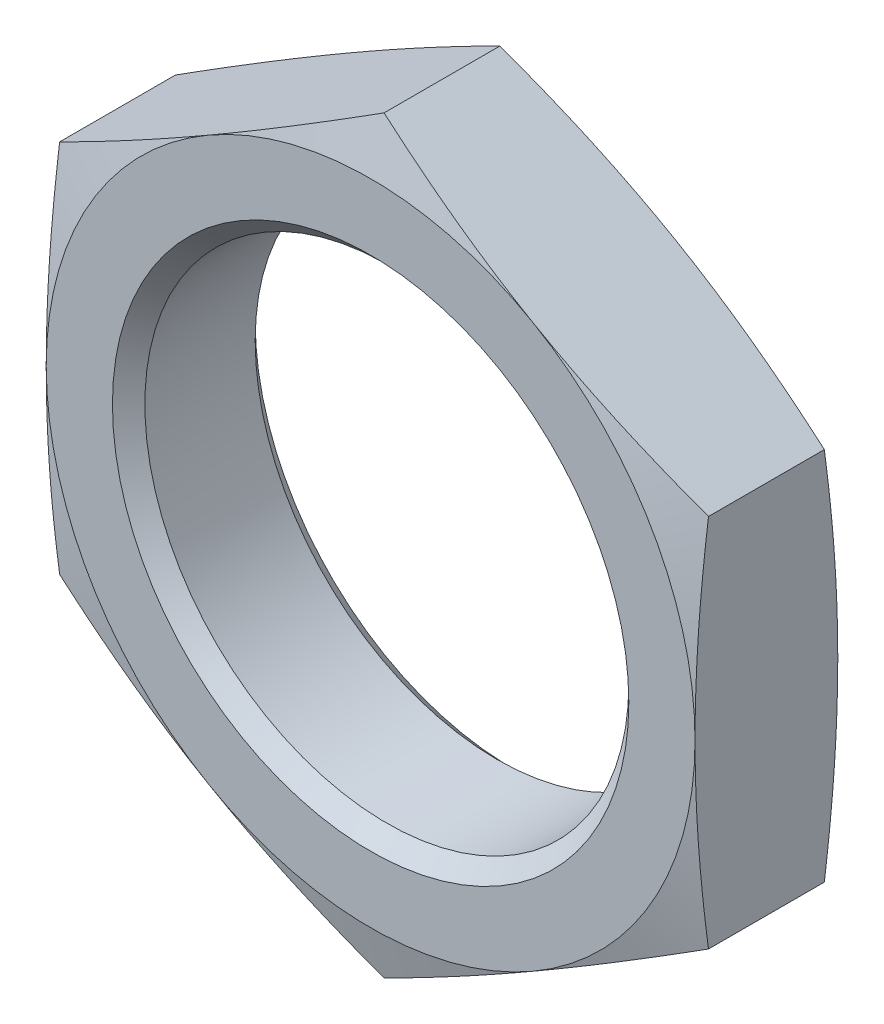
ISO-10303-21;
HEADER;
FILE_DESCRIPTION(('STEP AP214'),'2;1');
FILE_NAME('part.step','',(''),(''),'','','');
FILE_SCHEMA(('AUTOMOTIVE_DESIGN { 1 0 10303 214 1 1 1 1 }'));
ENDSEC;
DATA;
#1=APPLICATION_CONTEXT('core data for automotive mechanical design processes');
#2=APPLICATION_PROTOCOL_DEFINITION('international standard','automotive_design',2000,#1);
#3=PRODUCT_CONTEXT('',#1,'mechanical');
#4=PRODUCT('Part','Part','',(#3));
#5=PRODUCT_RELATED_PRODUCT_CATEGORY('part','',(#4));
#6=PRODUCT_DEFINITION_FORMATION('','',#4);
#7=PRODUCT_DEFINITION_CONTEXT('part definition',#1,'design');
#8=PRODUCT_DEFINITION('design','',#6,#7);
#9=PRODUCT_DEFINITION_SHAPE('','',#8);
#10=(LENGTH_UNIT() NAMED_UNIT(*) SI_UNIT(.MILLI.,.METRE.));
#11=(NAMED_UNIT(*) PLANE_ANGLE_UNIT() SI_UNIT($,.RADIAN.));
#12=(NAMED_UNIT(*) SI_UNIT($,.STERADIAN.) SOLID_ANGLE_UNIT());
#13=UNCERTAINTY_MEASURE_WITH_UNIT(LENGTH_MEASURE(1.E-05),#10,'distance_accuracy_value','');
#14=(GEOMETRIC_REPRESENTATION_CONTEXT(3) GLOBAL_UNCERTAINTY_ASSIGNED_CONTEXT((#13)) GLOBAL_UNIT_ASSIGNED_CONTEXT((#10,
#11,#12)) REPRESENTATION_CONTEXT('',''));
#15=CARTESIAN_POINT('',(0.,0.,0.));
#16=DIRECTION('',(0.,0.,1.));
#17=DIRECTION('',(1.,0.,0.));
#18=AXIS2_PLACEMENT_3D('',#15,#16,#17);
#19=CARTESIAN_POINT('',(0.,0.,0.));
#20=DIRECTION('',(0.,0.,1.));
#21=DIRECTION('',(1.,0.,0.));
#22=AXIS2_PLACEMENT_3D('',#19,#20,#21);
#23=PLANE('',#22);
#24=CARTESIAN_POINT('',(0.,0.,-2.84216281152411E-11));
#25=DIRECTION('',(0.,0.,1.));
#26=DIRECTION('',(1.,0.,0.));
#27=AXIS2_PLACEMENT_3D('',#24,#25,#26);
#28=CIRCLE('',#27,4.99999999999545);
#29=CARTESIAN_POINT('',(-2.49999999999886,4.33012701892022,-2.78124774843226E-11));
#30=VERTEX_POINT('',#29);
#31=CARTESIAN_POINT('',(-4.99999999999773,0.,-2.78123528559672E-11));
#32=VERTEX_POINT('',#31);
#33=EDGE_CURVE('E123',#30,#32,#28,.T.);
#34=ORIENTED_EDGE('',*,*,#33,.F.);
#35=CARTESIAN_POINT('',(0.,0.,-2.84216281152411E-11));
#36=DIRECTION('',(0.,0.,1.));
#37=DIRECTION('',(1.,0.,0.));
#38=AXIS2_PLACEMENT_3D('',#35,#36,#37);
#39=CIRCLE('',#38,4.99999999999545);
#40=CARTESIAN_POINT('',(2.49999999999886,4.33012701892022,-2.78123651654602E-11));
#41=VERTEX_POINT('',#40);
#42=EDGE_CURVE('E108',#41,#30,#39,.T.);
#43=ORIENTED_EDGE('',*,*,#42,.F.);
#44=CARTESIAN_POINT('',(0.,0.,-2.84216281152411E-11));
#45=DIRECTION('',(0.,0.,1.));
#46=DIRECTION('',(1.,0.,0.));
#47=AXIS2_PLACEMENT_3D('',#44,#45,#46);
#48=CIRCLE('',#47,4.99999999999545);
#49=CARTESIAN_POINT('',(4.99999999999773,0.,-2.78123687109876E-11));
#50=VERTEX_POINT('',#49);
#51=EDGE_CURVE('E102',#50,#41,#48,.T.);
#52=ORIENTED_EDGE('',*,*,#51,.F.);
#53=CARTESIAN_POINT('',(0.,0.,-2.84216281152411E-11));
#54=DIRECTION('',(0.,0.,1.));
#55=DIRECTION('',(1.,0.,0.));
#56=AXIS2_PLACEMENT_3D('',#53,#54,#55);
#57=CIRCLE('',#56,4.99999999999545);
#58=CARTESIAN_POINT('',(2.49999999999886,-4.33012701892023,-2.78123610133049E-11));
#59=VERTEX_POINT('',#58);
#60=EDGE_CURVE('E105',#59,#50,#57,.T.);
#61=ORIENTED_EDGE('',*,*,#60,.F.);
#62=CARTESIAN_POINT('',(0.,0.,-2.84216281152411E-11));
#63=DIRECTION('',(0.,0.,1.));
#64=DIRECTION('',(1.,0.,0.));
#65=AXIS2_PLACEMENT_3D('',#62,#63,#64);
#66=CIRCLE('',#65,4.99999999999545);
#67=CARTESIAN_POINT('',(-2.49999999999887,-4.33012701892022,-2.78124191460508E-11));
#68=VERTEX_POINT('',#67);
#69=EDGE_CURVE('E139',#68,#59,#66,.T.);
#70=ORIENTED_EDGE('',*,*,#69,.F.);
#71=CARTESIAN_POINT('',(0.,0.,-2.84216281152411E-11));
#72=DIRECTION('',(0.,0.,1.));
#73=DIRECTION('',(1.,0.,0.));
#74=AXIS2_PLACEMENT_3D('',#71,#72,#73);
#75=CIRCLE('',#74,4.99999999999545);
#76=EDGE_CURVE('E122',#32,#68,#75,.T.);
#77=ORIENTED_EDGE('',*,*,#76,.F.);
#78=EDGE_LOOP('',(#34,#43,#52,#61,#70,#77));
#79=FACE_BOUND('',#78,.T.);
#80=CARTESIAN_POINT('',(0.,0.,0.));
#81=DIRECTION('',(0.,0.,-1.));
#82=DIRECTION('',(-1.,0.,0.));
#83=AXIS2_PLACEMENT_3D('',#80,#81,#82);
#84=CIRCLE('',#83,3.97949999995717);
#85=CARTESIAN_POINT('',(-3.97949999995717,0.,0.));
#86=VERTEX_POINT('',#85);
#87=EDGE_CURVE('E20',#86,#86,#84,.F.);
#88=ORIENTED_EDGE('',*,*,#87,.T.);
#89=EDGE_LOOP('',(#88));
#90=FACE_BOUND('',#89,.T.);
#91=ADVANCED_FACE('F17',(#79,#90),#23,.F.);
#92=CARTESIAN_POINT('',(0.,0.,0.));
#93=DIRECTION('',(0.,0.,-1.));
#94=DIRECTION('',(-1.,0.,0.));
#95=AXIS2_PLACEMENT_3D('',#92,#93,#94);
#96=CONICAL_SURFACE('',#95,3.97949999995717,0.785398163397449);
#97=CARTESIAN_POINT('',(0.,0.,0.249999999999999));
#98=DIRECTION('',(0.,0.,1.));
#99=DIRECTION('',(1.,0.,0.));
#100=AXIS2_PLACEMENT_3D('',#97,#98,#99);
#101=CIRCLE('',#100,3.7295);
#102=CARTESIAN_POINT('',(3.7295,0.,0.249999999999999));
#103=VERTEX_POINT('',#102);
#104=EDGE_CURVE('E136',#103,#103,#101,.T.);
#105=ORIENTED_EDGE('',*,*,#104,.T.);
#106=EDGE_LOOP('',(#105));
#107=FACE_BOUND('',#106,.T.);
#108=ORIENTED_EDGE('',*,*,#87,.F.);
#109=EDGE_LOOP('',(#108));
#110=FACE_BOUND('',#109,.T.);
#111=ADVANCED_FACE('F322',(#107,#110),#96,.F.);
#112=CARTESIAN_POINT('',(0.,0.,0.20850297812558));
#113=DIRECTION('',(0.,0.,1.));
#114=DIRECTION('',(1.,0.,0.));
#115=AXIS2_PLACEMENT_3D('',#112,#113,#114);
#116=CONICAL_SURFACE('',#115,5.77814370802798,1.30899693900615);
#117=ORIENTED_EDGE('',*,*,#51,.T.);
#118=CARTESIAN_POINT('',(4.99999999999982,2.88675134594396,0.207259421604309));
#119=CARTESIAN_POINT('',(4.79274977391974,3.00640731976364,0.175186890195424));
#120=CARTESIAN_POINT('',(4.5851275494646,3.12627806694369,0.146063472441883));
#121=CARTESIAN_POINT('',(4.16947192641687,3.3662569528013,0.0949189941735746));
#122=CARTESIAN_POINT('',(3.96143926446961,3.48636466617648,0.0728898900928857));
#123=CARTESIAN_POINT('',(3.54477440482868,3.72692623505181,0.0370556247844137));
#124=CARTESIAN_POINT('',(3.33614207734093,3.84738016548861,0.0232524038315288));
#125=CARTESIAN_POINT('',(3.02285696661067,4.02825540850186,0.00935120928899862));
#126=CARTESIAN_POINT('',(2.91831147395219,4.08861477683079,0.00585136476814262));
#127=CARTESIAN_POINT('',(2.70917830353841,4.20935786906566,0.00117297669095066));
#128=CARTESIAN_POINT('',(2.6045906245341,4.26974159369271,-5.49217769852339E-06));
#129=CARTESIAN_POINT('',(2.50000000000015,4.3301270189221,-2.72032627560655E-11));
#130=B_SPLINE_CURVE_WITH_KNOTS('',3,(#118,#119,#120,#121,#122,#123,#124,#125,#126,#127,#128,
#129),.UNSPECIFIED.,.F.,.F.,(4,2,2,2,2,4),(0.,0.724386084307364,1.44794794084685,
2.17168039959221,2.53396910222482,2.89626946090421),.UNSPECIFIED.);
#131=CARTESIAN_POINT('',(5.00000000000101,2.88675134594861,0.207259421601373));
#132=VERTEX_POINT('',#131);
#133=EDGE_CURVE('E128',#132,#41,#130,.T.);
#134=ORIENTED_EDGE('',*,*,#133,.F.);
#135=CARTESIAN_POINT('',(4.99999999999827,0.,-2.58770436589553E-11));
#136=CARTESIAN_POINT('',(4.99999999999936,0.120770850458777,-5.49217721805968E-06));
#137=CARTESIAN_POINT('',(4.99999999999983,0.241538299712885,0.00117297669107871));
#138=CARTESIAN_POINT('',(5.00000000000017,0.483024484182612,0.00585136476800767));
#139=CARTESIAN_POINT('',(5.00000000000006,0.603743220840474,0.00935120928895306));
#140=CARTESIAN_POINT('',(4.99999999999988,0.965493706866905,0.0232524038315969));
#141=CARTESIAN_POINT('',(4.99999999999997,1.20640156774037,0.0370556247843522));
#142=CARTESIAN_POINT('',(5.00000000000003,1.68752470549128,0.0728898900929081));
#143=CARTESIAN_POINT('',(5.00000000000002,1.92774013224203,0.0949189941738092));
#144=CARTESIAN_POINT('',(4.99999999999998,2.40769790395597,0.146063472441565));
#145=CARTESIAN_POINT('',(4.99999999999997,2.64743939831443,0.175186890194341));
#146=CARTESIAN_POINT('',(5.,2.88675134594986,0.207259421601308));
#147=B_SPLINE_CURVE_WITH_KNOTS('',3,(#135,#136,#137,#138,#139,#140,#141,#142,#143,#144,#145,
#146),.UNSPECIFIED.,.F.,.F.,(4,2,2,2,2,4),(0.,0.362300358679372,0.724589061311954,
1.44832152005728,2.17188337659662,2.89626946090382),.UNSPECIFIED.);
#148=EDGE_CURVE('E125',#50,#132,#147,.T.);
#149=ORIENTED_EDGE('',*,*,#148,.F.);
#150=EDGE_LOOP('',(#117,#134,#149));
#151=FACE_BOUND('',#150,.T.);
#152=ADVANCED_FACE('F126',(#151),#116,.T.);
#153=CARTESIAN_POINT('',(0.,0.,0.20850297812558));
#154=DIRECTION('',(0.,0.,1.));
#155=DIRECTION('',(1.,0.,0.));
#156=AXIS2_PLACEMENT_3D('',#153,#154,#155);
#157=CONICAL_SURFACE('',#156,5.77814370802798,1.30899693900615);
#158=ORIENTED_EDGE('',*,*,#42,.T.);
#159=CARTESIAN_POINT('',(4.15311703126105E-12,5.77350269189416,0.207259421604543));
#160=CARTESIAN_POINT('',(-0.207250226078393,5.65384671807868,0.175186890195551));
#161=CARTESIAN_POINT('',(-0.414872450534581,5.53397597090033,0.146063472441959));
#162=CARTESIAN_POINT('',(-0.83052807358312,5.29399708504393,0.0949189941736009));
#163=CARTESIAN_POINT('',(-1.03856073553016,5.17388937166825,0.0728898900929132));
#164=CARTESIAN_POINT('',(-1.45522559517099,4.93332780279254,0.0370556247844337));
#165=CARTESIAN_POINT('',(-1.66385792265887,4.81287387235585,0.02325240383154));
#166=CARTESIAN_POINT('',(-1.97714303338922,4.63199862934261,0.00935120928900247));
#167=CARTESIAN_POINT('',(-2.08168852604772,4.57163926101365,0.00585136476814501));
#168=CARTESIAN_POINT('',(-2.29082169646154,4.45089616877875,0.00117297669095128));
#169=CARTESIAN_POINT('',(-2.39540937546587,4.39051244415167,-5.49217769821757E-06));
#170=CARTESIAN_POINT('',(-2.49999999999985,4.33012701892228,-2.72031555624137E-11));
#171=B_SPLINE_CURVE_WITH_KNOTS('',3,(#159,#160,#161,#162,#163,#164,#165,#166,#167,#168,#169,
#170),.UNSPECIFIED.,.F.,.F.,(4,2,2,2,2,4),(0.,0.724386084307528,1.44794794084717,
2.17168039959269,2.53396910222538,2.89626946090485),.UNSPECIFIED.);
#172=CARTESIAN_POINT('',(6.9144708611014E-13,5.77350269189734,0.207259421601365));
#173=VERTEX_POINT('',#172);
#174=EDGE_CURVE('E288',#173,#30,#171,.T.);
#175=ORIENTED_EDGE('',*,*,#174,.F.);
#176=CARTESIAN_POINT('',(2.49999999999914,4.3301270189207,-2.5877053783396E-11));
#177=CARTESIAN_POINT('',(2.39540937546575,4.39051244415101,-5.49217721795612E-06));
#178=CARTESIAN_POINT('',(2.29082169646171,4.45089616877845,0.00117297669107813));
#179=CARTESIAN_POINT('',(2.08168852604818,4.57163926101359,0.00585136476800445));
#180=CARTESIAN_POINT('',(1.97714303338967,4.63199862934241,0.00935120928894788));
#181=CARTESIAN_POINT('',(1.66385792265941,4.81287387235542,0.0232524038315845));
#182=CARTESIAN_POINT('',(1.45522559517172,4.93332780279219,0.0370556247843331));
#183=CARTESIAN_POINT('',(1.03856073553109,5.17388937166765,0.0728898900928717));
#184=CARTESIAN_POINT('',(0.830528073584061,5.29399708504298,0.0949189941737622));
#185=CARTESIAN_POINT('',(0.4148724505361,5.53397597089986,0.146063472441494));
#186=CARTESIAN_POINT('',(0.207250226080476,5.65384671807904,0.175186890194256));
#187=CARTESIAN_POINT('',(-8.67578578422901E-13,5.77350269189676,0.20725942160121));
#188=B_SPLINE_CURVE_WITH_KNOTS('',3,(#176,#177,#178,#179,#180,#181,#182,#183,#184,#185,#186,
#187),.UNSPECIFIED.,.F.,.F.,(4,2,2,2,2,4),(0.,0.362300358679281,0.724589061311769,
1.44832152005691,2.17188337659607,2.89626946090308),.UNSPECIFIED.);
#189=EDGE_CURVE('E289',#41,#173,#188,.T.);
#190=ORIENTED_EDGE('',*,*,#189,.F.);
#191=EDGE_LOOP('',(#158,#175,#190));
#192=FACE_BOUND('',#191,.T.);
#193=ADVANCED_FACE('F341',(#192),#157,.T.);
#194=CARTESIAN_POINT('',(0.,0.,0.20850297812558));
#195=DIRECTION('',(0.,0.,1.));
#196=DIRECTION('',(1.,0.,0.));
#197=AXIS2_PLACEMENT_3D('',#194,#195,#196);
#198=CONICAL_SURFACE('',#197,5.77814370802798,1.30899693900615);
#199=ORIENTED_EDGE('',*,*,#33,.T.);
#200=CARTESIAN_POINT('',(-4.9999999999963,2.88675134595006,0.207259421604309));
#201=CARTESIAN_POINT('',(-4.99999999999867,2.6474393983148,0.175186890195424));
#202=CARTESIAN_POINT('',(-4.99999999999965,2.40769790395638,0.146063472441883));
#203=CARTESIAN_POINT('',(-5.00000000000036,1.92774013224241,0.0949189941735747));
#204=CARTESIAN_POINT('',(-5.00000000000009,1.68752470549158,0.0728898900928857));
#205=CARTESIAN_POINT('',(-4.99999999999991,1.2064015677406,0.0370556247844138));
#206=CARTESIAN_POINT('',(-4.99999999999998,0.965493706867129,0.0232524038315291));
#207=CARTESIAN_POINT('',(-5.00000000000001,0.603743220840679,0.00935120928899893));
#208=CARTESIAN_POINT('',(-5.,0.483024484182807,0.00585136476814292));
#209=CARTESIAN_POINT('',(-5.,0.241538299713066,0.00117297669095091));
#210=CARTESIAN_POINT('',(-4.99999999999999,0.120770850458954,-5.49217769831254E-06));
#211=CARTESIAN_POINT('',(-5.,1.78048101653083E-13,-2.72031031307067E-11));
#212=B_SPLINE_CURVE_WITH_KNOTS('',3,(#200,#201,#202,#203,#204,#205,#206,#207,#208,#209,#210,
#211),.UNSPECIFIED.,.F.,.F.,(4,2,2,2,2,4),(0.,0.724386084307363,1.44794794084684,
2.17168039959221,2.53396910222481,2.89626946090421),.UNSPECIFIED.);
#213=CARTESIAN_POINT('',(-5.00000000000092,2.88675134594876,0.207259421601373));
#214=VERTEX_POINT('',#213);
#215=EDGE_CURVE('E293',#214,#32,#212,.T.);
#216=ORIENTED_EDGE('',*,*,#215,.F.);
#217=CARTESIAN_POINT('',(-2.49999999999913,4.3301270189207,-2.5877053931384E-11));
#218=CARTESIAN_POINT('',(-2.60459062453363,4.26974159369225,-5.49217721806661E-06));
#219=CARTESIAN_POINT('',(-2.70917830353817,4.2093578690656,0.00117297669107861));
#220=CARTESIAN_POINT('',(-2.9183114739521,4.08861477683104,0.00585136476800732));
#221=CARTESIAN_POINT('',(-3.02285696661052,4.02825540850201,0.00935120928895255));
#222=CARTESIAN_POINT('',(-3.33614207734068,3.84738016548863,0.0232524038315962));
#223=CARTESIAN_POINT('',(-3.54477440482851,3.72692623505198,0.0370556247843516));
#224=CARTESIAN_POINT('',(-3.96143926446932,3.48636466617658,0.0728898900929076));
#225=CARTESIAN_POINT('',(-4.16947192641638,3.36625695280119,0.0949189941738088));
#226=CARTESIAN_POINT('',(-4.58512754946441,3.12627806694419,0.146063472441565));
#227=CARTESIAN_POINT('',(-4.79274977392007,3.00640731976495,0.17518689019434));
#228=CARTESIAN_POINT('',(-5.0000000000015,2.88675134594726,0.207259421601308));
#229=B_SPLINE_CURVE_WITH_KNOTS('',3,(#217,#218,#219,#220,#221,#222,#223,#224,#225,#226,#227,
#228),.UNSPECIFIED.,.F.,.F.,(4,2,2,2,2,4),(0.,0.362300358679373,0.724589061311954,
1.44832152005728,2.17188337659662,2.89626946090383),.UNSPECIFIED.);
#230=EDGE_CURVE('E294',#30,#214,#229,.T.);
#231=ORIENTED_EDGE('',*,*,#230,.F.);
#232=EDGE_LOOP('',(#199,#216,#231));
#233=FACE_BOUND('',#232,.T.);
#234=ADVANCED_FACE('F161',(#233),#198,.T.);
#235=CARTESIAN_POINT('',(0.,0.,0.20850297812558));
#236=DIRECTION('',(0.,0.,1.));
#237=DIRECTION('',(1.,0.,0.));
#238=AXIS2_PLACEMENT_3D('',#235,#236,#237);
#239=CONICAL_SURFACE('',#238,5.77814370802798,1.30899693900615);
#240=ORIENTED_EDGE('',*,*,#60,.T.);
#241=CARTESIAN_POINT('',(4.99999999999635,-2.88675134594987,0.207259421604237));
#242=CARTESIAN_POINT('',(4.99999999999869,-2.64743939831462,0.175186890195386));
#243=CARTESIAN_POINT('',(4.99999999999965,-2.40769790395622,0.14606347244186));
#244=CARTESIAN_POINT('',(5.00000000000035,-1.92774013224228,0.0949189941735665));
#245=CARTESIAN_POINT('',(5.00000000000009,-1.68752470549147,0.072889890092877));
#246=CARTESIAN_POINT('',(4.99999999999991,-1.20640156774051,0.0370556247844074));
#247=CARTESIAN_POINT('',(4.99999999999998,-0.965493706867063,0.0232524038315256));
#248=CARTESIAN_POINT('',(5.00000000000001,-0.603743220840637,0.00935120928899777));
#249=CARTESIAN_POINT('',(5.,-0.483024484182774,0.00585136476814217));
#250=CARTESIAN_POINT('',(5.,-0.241538299713049,0.00117297669095069));
#251=CARTESIAN_POINT('',(4.99999999999999,-0.120770850458945,-5.49217769842981E-06));
#252=CARTESIAN_POINT('',(5.,-1.77893740852456E-13,-2.72030917476044E-11));
#253=B_SPLINE_CURVE_WITH_KNOTS('',3,(#241,#242,#243,#244,#245,#246,#247,#248,#249,#250,#251,
#252),.UNSPECIFIED.,.F.,.F.,(4,2,2,2,2,4),(0.,0.724386084307313,1.44794794084674,
2.17168039959206,2.53396910222464,2.89626946090401),.UNSPECIFIED.);
#254=CARTESIAN_POINT('',(5.00000000000029,-2.88675134594902,0.207259421601263));
#255=VERTEX_POINT('',#254);
#256=EDGE_CURVE('E117',#255,#50,#253,.T.);
#257=ORIENTED_EDGE('',*,*,#256,.F.);
#258=CARTESIAN_POINT('',(2.49999999999913,-4.3301270189207,-2.58764561935264E-11));
#259=CARTESIAN_POINT('',(2.60459062453364,-4.26974159369225,-5.49217721779102E-06));
#260=CARTESIAN_POINT('',(2.70917830353818,-4.20935786906559,0.00117297669107892));
#261=CARTESIAN_POINT('',(2.91831147395213,-4.08861477683102,0.00585136476800818));
#262=CARTESIAN_POINT('',(3.02285696661055,-4.02825540850199,0.00935120928895393));
#263=CARTESIAN_POINT('',(3.33614207734074,-3.8473801654886,0.0232524038315995));
#264=CARTESIAN_POINT('',(3.54477440482858,-3.72692623505194,0.0370556247843567));
#265=CARTESIAN_POINT('',(3.96143926446941,-3.48636466617653,0.0728898900929174));
#266=CARTESIAN_POINT('',(4.16947192641649,-3.36625695280113,0.0949189941738214));
#267=CARTESIAN_POINT('',(4.58512754946455,-3.12627806694411,0.146063472441584));
#268=CARTESIAN_POINT('',(4.79274977392022,-3.00640731976486,0.175186890194362));
#269=CARTESIAN_POINT('',(5.00000000000167,-2.88675134594717,0.207259421601334));
#270=B_SPLINE_CURVE_WITH_KNOTS('',3,(#258,#259,#260,#261,#262,#263,#264,#265,#266,#267,#268,
#269),.UNSPECIFIED.,.F.,.F.,(4,2,2,2,2,4),(0.,0.362300358679397,0.724589061312002,
1.44832152005738,2.17188337659677,2.89626946090402),.UNSPECIFIED.);
#271=EDGE_CURVE('E120',#59,#255,#270,.T.);
#272=ORIENTED_EDGE('',*,*,#271,.F.);
#273=EDGE_LOOP('',(#240,#257,#272));
#274=FACE_BOUND('',#273,.T.);
#275=ADVANCED_FACE('F115',(#274),#239,.T.);
#276=CARTESIAN_POINT('',(0.,0.,0.20850297812558));
#277=DIRECTION('',(0.,0.,1.));
#278=DIRECTION('',(1.,0.,0.));
#279=AXIS2_PLACEMENT_3D('',#276,#277,#278);
#280=CONICAL_SURFACE('',#279,5.77814370802798,1.30899693900615);
#281=CARTESIAN_POINT('',(-4.99999999999982,-2.88675134594396,0.207259421604309));
#282=CARTESIAN_POINT('',(-4.79274977391974,-3.00640731976364,0.175186890195424));
#283=CARTESIAN_POINT('',(-4.5851275494646,-3.12627806694369,0.146063472441883));
#284=CARTESIAN_POINT('',(-4.16947192641688,-3.3662569528013,0.0949189941735747));
#285=CARTESIAN_POINT('',(-3.96143926446961,-3.48636466617648,0.0728898900928858));
#286=CARTESIAN_POINT('',(-3.54477440482869,-3.72692623505181,0.0370556247844139));
#287=CARTESIAN_POINT('',(-3.33614207734093,-3.84738016548861,0.0232524038315291));
#288=CARTESIAN_POINT('',(-3.02285696661068,-4.02825540850186,0.00935120928899886));
#289=CARTESIAN_POINT('',(-2.91831147395219,-4.08861477683079,0.00585136476814282));
#290=CARTESIAN_POINT('',(-2.70917830353842,-4.20935786906565,0.00117297669095081));
#291=CARTESIAN_POINT('',(-2.60459062453411,-4.2697415936927,-5.49217769838704E-06));
#292=CARTESIAN_POINT('',(-2.50000000000016,-4.3301270189221,-2.72030964376832E-11));
#293=B_SPLINE_CURVE_WITH_KNOTS('',3,(#281,#282,#283,#284,#285,#286,#287,#288,#289,#290,#291,
#292),.UNSPECIFIED.,.F.,.F.,(4,2,2,2,2,4),(0.,0.724386084307363,1.44794794084684,
2.17168039959221,2.53396910222481,2.89626946090421),.UNSPECIFIED.);
#294=CARTESIAN_POINT('',(-5.000000000001,-2.88675134594861,0.207259421601373));
#295=VERTEX_POINT('',#294);
#296=EDGE_CURVE('E175',#295,#68,#293,.T.);
#297=ORIENTED_EDGE('',*,*,#296,.F.);
#298=CARTESIAN_POINT('',(-4.99999999999827,0.,-2.58770212452696E-11));
#299=CARTESIAN_POINT('',(-4.99999999999936,-0.120770850458777,-5.49217721793001E-06));
#300=CARTESIAN_POINT('',(-4.99999999999983,-0.241538299712885,0.0011729766910788));
#301=CARTESIAN_POINT('',(-5.00000000000017,-0.483024484182611,0.00585136476800759));
#302=CARTESIAN_POINT('',(-5.00000000000006,-0.603743220840473,0.00935120928895283));
#303=CARTESIAN_POINT('',(-4.99999999999988,-0.965493706866904,0.0232524038315965));
#304=CARTESIAN_POINT('',(-4.99999999999997,-1.20640156774037,0.0370556247843519));
#305=CARTESIAN_POINT('',(-5.00000000000003,-1.68752470549128,0.0728898900929078));
#306=CARTESIAN_POINT('',(-5.00000000000002,-1.92774013224203,0.0949189941738089));
#307=CARTESIAN_POINT('',(-4.99999999999998,-2.40769790395597,0.146063472441565));
#308=CARTESIAN_POINT('',(-4.99999999999997,-2.64743939831443,0.17518689019434));
#309=CARTESIAN_POINT('',(-5.,-2.88675134594986,0.207259421601308));
#310=B_SPLINE_CURVE_WITH_KNOTS('',3,(#298,#299,#300,#301,#302,#303,#304,#305,#306,#307,#308,
#309),.UNSPECIFIED.,.F.,.F.,(4,2,2,2,2,4),(0.,0.362300358679372,0.724589061311953,
1.44832152005728,2.17188337659662,2.89626946090382),.UNSPECIFIED.);
#311=EDGE_CURVE('E556',#32,#295,#310,.T.);
#312=ORIENTED_EDGE('',*,*,#311,.F.);
#313=ORIENTED_EDGE('',*,*,#76,.T.);
#314=EDGE_LOOP('',(#297,#312,#313));
#315=FACE_BOUND('',#314,.T.);
#316=ADVANCED_FACE('F160',(#315),#280,.T.);
#317=CARTESIAN_POINT('',(0.,0.,0.20850297812558));
#318=DIRECTION('',(0.,0.,1.));
#319=DIRECTION('',(1.,0.,0.));
#320=AXIS2_PLACEMENT_3D('',#317,#318,#319);
#321=CONICAL_SURFACE('',#320,5.77814370802798,1.30899693900615);
#322=CARTESIAN_POINT('',(-3.32575998798081E-12,-5.77350269189397,0.207259421604236));
#323=CARTESIAN_POINT('',(0.207250226079095,-5.65384671807837,0.175186890195385));
#324=CARTESIAN_POINT('',(0.414872450535194,-5.5339759709,0.146063472441859));
#325=CARTESIAN_POINT('',(0.830528073583591,-5.29399708504363,0.0949189941735666));
#326=CARTESIAN_POINT('',(1.03856073553058,-5.17388937166801,0.0728898900928773));
#327=CARTESIAN_POINT('',(1.45522559517129,-4.93332780279237,0.0370556247844077));
#328=CARTESIAN_POINT('',(1.66385792265911,-4.81287387235571,0.0232524038315256));
#329=CARTESIAN_POINT('',(1.97714303338937,-4.63199862934252,0.00935120928899764));
#330=CARTESIAN_POINT('',(2.08168852604784,-4.57163926101359,0.0058513647681421));
#331=CARTESIAN_POINT('',(2.2908216964616,-4.45089616877871,0.0011729766909507));
#332=CARTESIAN_POINT('',(2.39540937546589,-4.39051244415166,-5.49217769839516E-06));
#333=CARTESIAN_POINT('',(2.49999999999984,-4.33012701892228,-2.72031370628245E-11));
#334=B_SPLINE_CURVE_WITH_KNOTS('',3,(#322,#323,#324,#325,#326,#327,#328,#329,#330,#331,#332,
#333),.UNSPECIFIED.,.F.,.F.,(4,2,2,2,2,4),(0.,0.724386084307312,1.44794794084674,
2.17168039959206,2.53396910222464,2.89626946090401),.UNSPECIFIED.);
#335=CARTESIAN_POINT('',(-6.25286092583308E-13,-5.77350269189696,0.207259421601263));
#336=VERTEX_POINT('',#335);
#337=EDGE_CURVE('E174',#336,#59,#334,.T.);
#338=ORIENTED_EDGE('',*,*,#337,.F.);
#339=CARTESIAN_POINT('',(-2.49999999999914,-4.33012701892069,-2.58769131531936E-11));
#340=CARTESIAN_POINT('',(-2.39540937546573,-4.39051244415103,-5.49217721792537E-06));
#341=CARTESIAN_POINT('',(-2.29082169646165,-4.45089616877849,0.00117297669107888));
#342=CARTESIAN_POINT('',(-2.08168852604805,-4.57163926101366,0.00585136476800817));
#343=CARTESIAN_POINT('',(-1.97714303338951,-4.6319986293425,0.00935120928895386));
#344=CARTESIAN_POINT('',(-1.66385792265914,-4.81287387235557,0.0232524038315994));
#345=CARTESIAN_POINT('',(-1.45522559517138,-4.93332780279239,0.0370556247843567));
#346=CARTESIAN_POINT('',(-1.03856073553062,-5.17388937166792,0.0728898900929174));
#347=CARTESIAN_POINT('',(-0.830528073583527,-5.29399708504329,0.0949189941738212));
#348=CARTESIAN_POINT('',(-0.414872450535433,-5.53397597090025,0.146063472441583));
#349=CARTESIAN_POINT('',(-0.207250226079742,-5.65384671807947,0.175186890194362));
#350=CARTESIAN_POINT('',(1.66732736200133E-12,-5.77350269189722,0.207259421601334));
#351=B_SPLINE_CURVE_WITH_KNOTS('',3,(#339,#340,#341,#342,#343,#344,#345,#346,#347,#348,#349,
#350),.UNSPECIFIED.,.F.,.F.,(4,2,2,2,2,4),(0.,0.362300358679398,0.724589061312004,
1.44832152005738,2.17188337659677,2.89626946090402),.UNSPECIFIED.);
#352=EDGE_CURVE('E299',#68,#336,#351,.T.);
#353=ORIENTED_EDGE('',*,*,#352,.F.);
#354=ORIENTED_EDGE('',*,*,#69,.T.);
#355=EDGE_LOOP('',(#338,#353,#354));
#356=FACE_BOUND('',#355,.T.);
#357=ADVANCED_FACE('F307',(#356),#321,.T.);
#358=CARTESIAN_POINT('',(0.,0.,-13.2328653636754));
#359=DIRECTION('',(0.,0.,1.));
#360=DIRECTION('',(1.,0.,0.));
#361=AXIS2_PLACEMENT_3D('',#358,#359,#360);
#362=CYLINDRICAL_SURFACE('',#361,3.7295);
#363=ORIENTED_EDGE('',*,*,#104,.F.);
#364=EDGE_LOOP('',(#363));
#365=FACE_BOUND('',#364,.T.);
#366=CARTESIAN_POINT('',(0.,0.,1.9500000000221));
#367=DIRECTION('',(0.,0.,1.));
#368=DIRECTION('',(1.,0.,0.));
#369=AXIS2_PLACEMENT_3D('',#366,#367,#368);
#370=CIRCLE('',#369,3.72950000001993);
#371=CARTESIAN_POINT('',(3.72950000001993,0.,1.9500000000221));
#372=VERTEX_POINT('',#371);
#373=EDGE_CURVE('E280',#372,#372,#370,.T.);
#374=ORIENTED_EDGE('',*,*,#373,.T.);
#375=EDGE_LOOP('',(#374));
#376=FACE_BOUND('',#375,.T.);
#377=ADVANCED_FACE('F310',(#365,#376),#362,.F.);
#378=CARTESIAN_POINT('',(5.,-2.88675134594813,0.));
#379=DIRECTION('',(1.,0.,0.));
#380=DIRECTION('',(0.,1.,0.));
#381=AXIS2_PLACEMENT_3D('',#378,#379,#380);
#382=PLANE('',#381);
#383=CARTESIAN_POINT('',(5.,0.,2.19999999998655));
#384=CARTESIAN_POINT('',(5.,0.120770851930322,2.20000549213732));
#385=CARTESIAN_POINT('',(5.,0.24153830265585,2.19882702323993));
#386=CARTESIAN_POINT('',(5.,0.483024490066577,2.19414863504951));
#387=CARTESIAN_POINT('',(5.,0.603743228194019,2.19064879044416));
#388=CARTESIAN_POINT('',(5.,0.965493718616316,2.17674759556837));
#389=CARTESIAN_POINT('',(5.,1.20640158241163,2.16294437428691));
#390=CARTESIAN_POINT('',(5.,1.68752472598251,2.1271101081472));
#391=CARTESIAN_POINT('',(5.,1.9277401556314,2.10508100356398));
#392=CARTESIAN_POINT('',(5.,2.4076979331289,2.053936524163));
#393=CARTESIAN_POINT('',(5.,2.64743943037274,2.02481310577902));
#394=CARTESIAN_POINT('',(5.,2.886751380883,1.99274057370013));
#395=B_SPLINE_CURVE_WITH_KNOTS('',3,(#383,#384,#385,#386,#387,#388,#389,#390,#391,#392,#393,
#394),.UNSPECIFIED.,.F.,.F.,(4,2,2,2,2,4),(0.,0.362300363093583,0.724589070139678,
1.44832153768674,2.17188340301903,2.89626949614406),.UNSPECIFIED.);
#396=CARTESIAN_POINT('',(4.99999999999773,0.,2.19999999998716));
#397=VERTEX_POINT('',#396);
#398=CARTESIAN_POINT('',(4.99999997650228,2.88675135951454,1.99274058201562));
#399=VERTEX_POINT('',#398);
#400=EDGE_CURVE('E516',#397,#399,#395,.T.);
#401=ORIENTED_EDGE('',*,*,#400,.F.);
#402=CARTESIAN_POINT('',(5.,-2.88675126545155,1.99274058916501));
#403=CARTESIAN_POINT('',(5.,-2.64743932443985,2.02481311901247));
#404=CARTESIAN_POINT('',(5.,-2.40769783672975,2.05393653530041));
#405=CARTESIAN_POINT('',(5.,-1.92774007834229,2.10508101093863));
#406=CARTESIAN_POINT('',(5.,-1.68752465826956,2.12711011385415));
#407=CARTESIAN_POINT('',(5.,-1.20640153392989,2.16294437723486));
#408=CARTESIAN_POINT('',(5.,-0.965493679789649,2.17674759742543));
#409=CARTESIAN_POINT('',(5.,-0.603743203893497,2.19064879119493));
#410=CARTESIAN_POINT('',(5.,-0.483024470622388,2.19414863551984));
#411=CARTESIAN_POINT('',(5.,-0.24153829293047,2.19882702333443));
#412=CARTESIAN_POINT('',(5.,-0.120770847067419,2.20000549213645));
#413=CARTESIAN_POINT('',(5.,0.,2.19999999998655));
#414=B_SPLINE_CURVE_WITH_KNOTS('',3,(#402,#403,#404,#405,#406,#407,#408,#409,#410,#411,#412,
#413),.UNSPECIFIED.,.F.,.F.,(4,2,2,2,2,4),(0.,0.72438606398595,1.447947900262,2.17168033872357,
2.53396903118479,2.89626937969115),.UNSPECIFIED.);
#415=CARTESIAN_POINT('',(5.00000000000029,-2.88675130569967,1.99274058377272));
#416=VERTEX_POINT('',#415);
#417=EDGE_CURVE('E217',#416,#397,#414,.T.);
#418=ORIENTED_EDGE('',*,*,#417,.F.);
#419=DIRECTION('',(0.,0.,1.));
#420=VECTOR('',#419,1.);
#421=CARTESIAN_POINT('',(5.00000000000059,-2.88675134594779,0.));
#422=LINE('',#421,#420);
#423=EDGE_CURVE('E135',#255,#416,#422,.T.);
#424=ORIENTED_EDGE('',*,*,#423,.F.);
#425=ORIENTED_EDGE('',*,*,#256,.T.);
#426=ORIENTED_EDGE('',*,*,#148,.T.);
#427=DIRECTION('',(0.,0.,1.));
#428=VECTOR('',#427,1.);
#429=CARTESIAN_POINT('',(5.00000001980392,2.88675133451433,0.));
#430=LINE('',#429,#428);
#431=EDGE_CURVE('E131',#399,#132,#430,.F.);
#432=ORIENTED_EDGE('',*,*,#431,.F.);
#433=EDGE_LOOP('',(#401,#418,#424,#425,#426,#432));
#434=FACE_BOUND('',#433,.T.);
#435=ADVANCED_FACE('F133',(#434),#382,.T.);
#436=CARTESIAN_POINT('',(5.,2.88675134594813,0.));
#437=DIRECTION('',(0.5,0.866025403784439,0.));
#438=DIRECTION('',(-0.866025403784439,0.5,0.));
#439=AXIS2_PLACEMENT_3D('',#436,#437,#438);
#440=PLANE('',#439);
#441=CARTESIAN_POINT('',(2.5,4.33012701892219,2.19999999998655));
#442=CARTESIAN_POINT('',(2.39540937821782,4.39051244256284,2.20000549213648));
#443=CARTESIAN_POINT('',(2.29082170196505,4.4508961656013,2.19882702333018));
#444=CARTESIAN_POINT('',(2.08168853705086,4.57163925466098,2.19414863549866));
#445=CARTESIAN_POINT('',(1.97714304714043,4.63199862140333,2.19064879116112));
#446=CARTESIAN_POINT('',(1.66385794463004,4.81287385967081,2.1767475973418));
#447=CARTESIAN_POINT('',(1.45522562260572,4.9333277869532,2.1629443771021));
#448=CARTESIAN_POINT('',(1.03856077384719,5.17388934954579,2.12711011359707));
#449=CARTESIAN_POINT('',(0.830528117318898,5.29399705979264,2.10508101060638));
#450=CARTESIAN_POINT('',(0.41487250508447,5.53397593940636,2.05393653479845));
#451=CARTESIAN_POINT('',(0.207250286023569,5.65384668347092,2.02481311841591));
#452=CARTESIAN_POINT('',(6.5316992490828E-08,5.77350265418547,1.99274058846769));
#453=B_SPLINE_CURVE_WITH_KNOTS('',3,(#441,#442,#443,#444,#445,#446,#447,#448,#449,#450,#451,
#452),.UNSPECIFIED.,.F.,.F.,(4,2,2,2,2,4),(0.,0.362300349147936,0.724589042250631,
1.44832148199131,2.17188331954515,2.89626938481267),.UNSPECIFIED.);
#454=CARTESIAN_POINT('',(2.49999999999886,4.33012701892022,2.19999999998716));
#455=VERTEX_POINT('',#454);
#456=CARTESIAN_POINT('',(-1.89464246202639E-08,5.77350268095753,1.99274058129413));
#457=VERTEX_POINT('',#456);
#458=EDGE_CURVE('E511',#455,#457,#453,.T.);
#459=ORIENTED_EDGE('',*,*,#458,.F.);
#460=CARTESIAN_POINT('',(4.99999993320064,2.88675138451476,1.99274058871441));
#461=CARTESIAN_POINT('',(4.79274971261586,3.00640735515899,2.02481311862689));
#462=CARTESIAN_POINT('',(4.58512749367728,3.12627809915293,2.0539365349759));
#463=CARTESIAN_POINT('',(4.16947188168809,3.36625697862506,2.10508101072376));
#464=CARTESIAN_POINT('',(3.96143922528272,3.48636468880094,2.12711011368787));
#465=CARTESIAN_POINT('',(3.54477437677115,3.72692625125094,2.16294437714897));
#466=CARTESIAN_POINT('',(3.33614205487088,3.84738017846172,2.17674759737132));
#467=CARTESIAN_POINT('',(3.02285695254716,4.02825541662142,2.19064879117305));
#468=CARTESIAN_POINT('',(2.91831146269916,4.08861478332773,2.19414863550613));
#469=CARTESIAN_POINT('',(2.70917829790992,4.20935787231527,2.19882702333168));
#470=CARTESIAN_POINT('',(2.60459062171966,4.26974159531764,2.20000549213647));
#471=CARTESIAN_POINT('',(2.5,4.33012701892219,2.19999999998655));
#472=B_SPLINE_CURVE_WITH_KNOTS('',3,(#460,#461,#462,#463,#464,#465,#466,#467,#468,#469,#470,
#471),.UNSPECIFIED.,.F.,.F.,(4,2,2,2,2,4),(0.,0.724386064834974,1.44794790195763,
2.17168034126667,2.53396903415285,2.89626938308423),.UNSPECIFIED.);
#473=EDGE_CURVE('E216',#399,#455,#472,.T.);
#474=ORIENTED_EDGE('',*,*,#473,.F.);
#475=ORIENTED_EDGE('',*,*,#431,.T.);
#476=ORIENTED_EDGE('',*,*,#133,.T.);
#477=ORIENTED_EDGE('',*,*,#189,.T.);
#478=DIRECTION('',(0.,0.,1.));
#479=VECTOR('',#478,1.);
#480=CARTESIAN_POINT('',(-4.1847089337393E-08,5.77350266773583,0.));
#481=LINE('',#480,#479);
#482=EDGE_CURVE('E285',#457,#173,#481,.F.);
#483=ORIENTED_EDGE('',*,*,#482,.F.);
#484=EDGE_LOOP('',(#459,#474,#475,#476,#477,#483));
#485=FACE_BOUND('',#484,.T.);
#486=ADVANCED_FACE('F318',(#485),#440,.T.);
#487=CARTESIAN_POINT('',(0.,5.77350269189626,0.));
#488=DIRECTION('',(-0.5,0.866025403784439,0.));
#489=DIRECTION('',(-0.866025403784439,-0.5,0.));
#490=AXIS2_PLACEMENT_3D('',#487,#488,#489);
#491=PLANE('',#490);
#492=CARTESIAN_POINT('',(-2.5,4.33012701892219,2.19999999998655));
#493=CARTESIAN_POINT('',(-2.60459062178218,4.26974159528154,2.20000549213648));
#494=CARTESIAN_POINT('',(-2.70917829803496,4.20935787224308,2.19882702333018));
#495=CARTESIAN_POINT('',(-2.91831146294916,4.08861478318339,2.19414863549866));
#496=CARTESIAN_POINT('',(-3.02285695285959,4.02825541644104,2.19064879116112));
#497=CARTESIAN_POINT('',(-3.33614205537,3.84738017817356,2.1767475973418));
#498=CARTESIAN_POINT('',(-3.54477437739432,3.72692625089116,2.1629443771021));
#499=CARTESIAN_POINT('',(-3.96143922615287,3.48636468829856,2.12711011359706));
#500=CARTESIAN_POINT('',(-4.16947188268117,3.36625697805171,2.10508101060637));
#501=CARTESIAN_POINT('',(-4.58512749491561,3.12627809843797,2.05393653479843));
#502=CARTESIAN_POINT('',(-4.79274971397652,3.00640735437341,2.0248131184159));
#503=CARTESIAN_POINT('',(-4.9999999346831,2.88675138365885,1.99274058846767));
#504=B_SPLINE_CURVE_WITH_KNOTS('',3,(#492,#493,#494,#495,#496,#497,#498,#499,#500,#501,#502,
#503),.UNSPECIFIED.,.F.,.F.,(4,2,2,2,2,4),(0.,0.36230034914795,0.724589042250659,
1.44832148199137,2.17188331954523,2.89626938481278),.UNSPECIFIED.);
#505=CARTESIAN_POINT('',(-2.49999999999886,4.33012701892022,2.19999999998716));
#506=VERTEX_POINT('',#505);
#507=CARTESIAN_POINT('',(-5.,2.8867513240705,1.99274058129416));
#508=VERTEX_POINT('',#507);
#509=EDGE_CURVE('E486',#506,#508,#504,.T.);
#510=ORIENTED_EDGE('',*,*,#509,.F.);
#511=CARTESIAN_POINT('',(1.98057876223145E-08,5.77350265851819,1.99274054712855));
#512=CARTESIAN_POINT('',(-0.2072502171281,5.65384670718666,2.02481309832255));
#513=CARTESIAN_POINT('',(-0.414872446297746,5.53397596905109,2.05393652422464));
#514=CARTESIAN_POINT('',(-0.830528073248757,5.29399708952746,2.10508100851848));
#515=CARTESIAN_POINT('',(-1.03856073439056,5.17388937345545,2.12711011049209));
#516=CARTESIAN_POINT('',(-1.45522559367924,4.93332780252429,2.16294437432533));
#517=CARTESIAN_POINT('',(-1.66385792162,4.81287387272958,2.17674759591913));
#518=CARTESIAN_POINT('',(-1.97714303272386,4.63199862983992,2.19064879072271));
#519=CARTESIAN_POINT('',(-2.08168852548627,4.57163926139439,2.19414863521366));
#520=CARTESIAN_POINT('',(-2.29082169613609,4.45089616891006,2.19882702322627));
#521=CARTESIAN_POINT('',(-2.39540937527253,4.39051244415013,2.20000549205961));
#522=CARTESIAN_POINT('',(-2.5,4.33012701892219,2.19999999998655));
#523=B_SPLINE_CURVE_WITH_KNOTS('',3,(#511,#512,#513,#514,#515,#516,#517,#518,#519,#520,#521,
#522),.UNSPECIFIED.,.F.,.F.,(4,2,2,2,2,4),(0.,0.724386085926705,1.44794794364566,
2.17168040283161,2.53396910589559,2.89626946510357),.UNSPECIFIED.);
#524=EDGE_CURVE('E491',#457,#506,#523,.T.);
#525=ORIENTED_EDGE('',*,*,#524,.F.);
#526=ORIENTED_EDGE('',*,*,#482,.T.);
#527=ORIENTED_EDGE('',*,*,#174,.T.);
#528=ORIENTED_EDGE('',*,*,#230,.T.);
#529=DIRECTION('',(0.,0.,1.));
#530=VECTOR('',#529,1.);
#531=CARTESIAN_POINT('',(-5.,2.88675129762707,0.));
#532=LINE('',#531,#530);
#533=EDGE_CURVE('E290',#508,#214,#532,.F.);
#534=ORIENTED_EDGE('',*,*,#533,.F.);
#535=EDGE_LOOP('',(#510,#525,#526,#527,#528,#534));
#536=FACE_BOUND('',#535,.T.);
#537=ADVANCED_FACE('F389',(#536),#491,.T.);
#538=CARTESIAN_POINT('',(-5.,2.88675134594813,0.));
#539=DIRECTION('',(-1.,0.,0.));
#540=DIRECTION('',(0.,0.,1.));
#541=AXIS2_PLACEMENT_3D('',#538,#539,#540);
#542=PLANE('',#541);
#543=DIRECTION('',(0.,0.,1.));
#544=VECTOR('',#543,1.);
#545=CARTESIAN_POINT('',(-5.0000000198117,-2.88675133450984,0.));
#546=LINE('',#545,#544);
#547=CARTESIAN_POINT('',(-4.99999997651923,-2.88675135950476,1.992740582013));
#548=VERTEX_POINT('',#547);
#549=EDGE_CURVE('E296',#548,#295,#546,.F.);
#550=ORIENTED_EDGE('',*,*,#549,.F.);
#551=CARTESIAN_POINT('',(-5.,0.,2.19999999998655));
#552=CARTESIAN_POINT('',(-5.,-0.120770851931123,2.20000549213731));
#553=CARTESIAN_POINT('',(-5.,-0.241538302657452,2.19882702323991));
#554=CARTESIAN_POINT('',(-5.,-0.483024490069781,2.19414863504943));
#555=CARTESIAN_POINT('',(-5.,-0.603743228198024,2.19064879044404));
#556=CARTESIAN_POINT('',(-5.,-0.965493718622715,2.17674759556807));
#557=CARTESIAN_POINT('',(-5.,-1.20640158241962,2.16294437428642));
#558=CARTESIAN_POINT('',(-5.,-1.68752472599367,2.12711010814626));
#559=CARTESIAN_POINT('',(-5.,-1.92774015564413,2.10508100356277));
#560=CARTESIAN_POINT('',(-5.,-2.40769793314478,2.05393652416116));
#561=CARTESIAN_POINT('',(-5.,-2.6474394303902,2.02481310577684));
#562=CARTESIAN_POINT('',(-5.,-2.88675138090202,1.99274057369758));
#563=B_SPLINE_CURVE_WITH_KNOTS('',3,(#551,#552,#553,#554,#555,#556,#557,#558,#559,#560,#561,
#562),.UNSPECIFIED.,.F.,.F.,(4,2,2,2,2,4),(0.,0.362300363095987,0.724589070144485,
1.44832153769634,2.17188340303342,2.89626949616325),.UNSPECIFIED.);
#564=CARTESIAN_POINT('',(-4.99999999999773,0.,2.19999999998716));
#565=VERTEX_POINT('',#564);
#566=EDGE_CURVE('E479',#565,#548,#563,.T.);
#567=ORIENTED_EDGE('',*,*,#566,.F.);
#568=CARTESIAN_POINT('',(-4.99999996119088,2.88675134641126,1.9927405471286));
#569=CARTESIAN_POINT('',(-4.99999998609071,2.64743940062042,2.02481309832258));
#570=CARTESIAN_POINT('',(-4.99999999627973,2.40769790670137,2.05393652422466));
#571=CARTESIAN_POINT('',(-5.00000000371604,1.92774013477406,2.10508100851849));
#572=CARTESIAN_POINT('',(-5.00000000097805,1.68752470737239,2.1271101104921));
#573=CARTESIAN_POINT('',(-4.99999999902172,1.20640156889857,2.16294437432534));
#574=CARTESIAN_POINT('',(-4.99999999980421,0.965493707953844,2.17674759591913));
#575=CARTESIAN_POINT('',(-5.00000000009801,0.603743221665653,2.19064879072271));
#576=CARTESIAN_POINT('',(-5.00000000004901,0.483024484859494,2.19414863521366));
#577=CARTESIAN_POINT('',(-4.99999999995099,0.241538300060611,2.19882702322627));
#578=CARTESIAN_POINT('',(-4.99999999990198,0.120770850625633,2.20000549205961));
#579=CARTESIAN_POINT('',(-5.,0.,2.19999999998655));
#580=B_SPLINE_CURVE_WITH_KNOTS('',3,(#568,#569,#570,#571,#572,#573,#574,#575,#576,#577,#578,
#579),.UNSPECIFIED.,.F.,.F.,(4,2,2,2,2,4),(0.,0.724386085926666,1.44794794364558,
2.17168040283149,2.53396910589545,2.89626946510341),.UNSPECIFIED.);
#581=EDGE_CURVE('E488',#508,#565,#580,.T.);
#582=ORIENTED_EDGE('',*,*,#581,.F.);
#583=ORIENTED_EDGE('',*,*,#533,.T.);
#584=ORIENTED_EDGE('',*,*,#215,.T.);
#585=ORIENTED_EDGE('',*,*,#311,.T.);
#586=EDGE_LOOP('',(#550,#567,#582,#583,#584,#585));
#587=FACE_BOUND('',#586,.T.);
#588=ADVANCED_FACE('F190',(#587),#542,.T.);
#589=CARTESIAN_POINT('',(0.,-5.77350269189626,0.));
#590=DIRECTION('',(0.5,-0.866025403784439,0.));
#591=DIRECTION('',(0.866025403784439,0.5,0.));
#592=AXIS2_PLACEMENT_3D('',#589,#590,#591);
#593=PLANE('',#592);
#594=ORIENTED_EDGE('',*,*,#423,.T.);
#595=CARTESIAN_POINT('',(2.5,-4.33012701892219,2.19999999998655));
#596=CARTESIAN_POINT('',(2.60459062580812,-4.26974159295716,2.20000549213732));
#597=CARTESIAN_POINT('',(2.70917830608649,-4.20935786759453,2.19882702323993));
#598=CARTESIAN_POINT('',(2.91831147904679,-4.08861477388942,2.19414863504953));
#599=CARTESIAN_POINT('',(3.02285697297774,-4.02825540482582,2.1906487904442));
#600=CARTESIAN_POINT('',(3.33614208751426,-3.84738015961506,2.17674759556847));
#601=CARTESIAN_POINT('',(3.54477441753201,-3.72692622771766,2.16294437428706));
#602=CARTESIAN_POINT('',(3.96143928221214,-3.48636465593272,2.12711010814751));
#603=CARTESIAN_POINT('',(4.16947194666863,-3.36625694110853,2.10508100356437));
#604=CARTESIAN_POINT('',(4.58512757472451,-3.12627805236029,2.05393652416358));
#605=CARTESIAN_POINT('',(4.79274980167856,-3.00640730373861,2.02481310577972));
#606=CARTESIAN_POINT('',(5.00000003024922,-2.88675132848374,1.99274057370094));
#607=B_SPLINE_CURVE_WITH_KNOTS('',3,(#595,#596,#597,#598,#599,#600,#601,#602,#603,#604,#605,
#606),.UNSPECIFIED.,.F.,.F.,(4,2,2,2,2,4),(0.,0.362300363092814,0.724589070138141,
1.44832153768367,2.17188340301443,2.89626949613792),.UNSPECIFIED.);
#608=CARTESIAN_POINT('',(2.49999999999886,-4.33012701892022,2.19999999998716));
#609=VERTEX_POINT('',#608);
#610=EDGE_CURVE('E208',#609,#416,#607,.T.);
#611=ORIENTED_EDGE('',*,*,#610,.F.);
#612=CARTESIAN_POINT('',(6.97152529568731E-08,-5.77350265164614,1.9927405891655));
#613=CARTESIAN_POINT('',(0.207250290060087,-5.65384668114044,2.02481311901289));
#614=CARTESIAN_POINT('',(0.414872508757844,-5.53397593728554,2.05393653530077));
#615=CARTESIAN_POINT('',(0.830528120264295,-5.29399705809211,2.10508101093887));
#616=CARTESIAN_POINT('',(1.03856077642776,-5.1738893480559,2.12711011385433));
#617=CARTESIAN_POINT('',(1.45522562445353,-4.93332778588637,2.16294437723495));
#618=CARTESIAN_POINT('',(1.66385794610991,-4.8128738588164,2.17674759742549));
#619=CARTESIAN_POINT('',(1.97714304806669,-4.63199862086856,2.19064879119495));
#620=CARTESIAN_POINT('',(2.08168853779201,-4.57163925423308,2.19414863551985));
#621=CARTESIAN_POINT('',(2.29082170233575,-4.45089616538728,2.19882702333444));
#622=CARTESIAN_POINT('',(2.39540937840318,-4.39051244245583,2.20000549213644));
#623=CARTESIAN_POINT('',(2.5,-4.33012701892219,2.19999999998655));
#624=B_SPLINE_CURVE_WITH_KNOTS('',3,(#612,#613,#614,#615,#616,#617,#618,#619,#620,#621,#622,
#623),.UNSPECIFIED.,.F.,.F.,(4,2,2,2,2,4),(0.,0.724386063985026,1.44794790026015,
2.17168033872081,2.53396903118156,2.89626937968746),.UNSPECIFIED.);
#625=CARTESIAN_POINT('',(3.48579196464091E-08,-5.77350267177137,1.99274058377296));
#626=VERTEX_POINT('',#625);
#627=EDGE_CURVE('E199',#626,#609,#624,.T.);
#628=ORIENTED_EDGE('',*,*,#627,.F.);
#629=DIRECTION('',(0.,0.,1.));
#630=VECTOR('',#629,1.);
#631=CARTESIAN_POINT('',(5.86336534880161E-13,-5.7735026918966,0.));
#632=LINE('',#631,#630);
#633=EDGE_CURVE('E283',#336,#626,#632,.T.);
#634=ORIENTED_EDGE('',*,*,#633,.F.);
#635=ORIENTED_EDGE('',*,*,#337,.T.);
#636=ORIENTED_EDGE('',*,*,#271,.T.);
#637=EDGE_LOOP('',(#594,#611,#628,#634,#635,#636));
#638=FACE_BOUND('',#637,.T.);
#639=ADVANCED_FACE('F185',(#638),#593,.T.);
#640=CARTESIAN_POINT('',(-5.,-2.88675134594813,0.));
#641=DIRECTION('',(-0.5,-0.866025403784439,0.));
#642=DIRECTION('',(0.866025403784439,-0.5,0.));
#643=AXIS2_PLACEMENT_3D('',#640,#641,#642);
#644=PLANE('',#643);
#645=ORIENTED_EDGE('',*,*,#633,.T.);
#646=CARTESIAN_POINT('',(-2.5,-4.33012701892219,2.19999999998655));
#647=CARTESIAN_POINT('',(-2.39540937419175,-4.3905124448873,2.20000549213732));
#648=CARTESIAN_POINT('',(-2.29082169391326,-4.45089617025,2.19882702323993));
#649=CARTESIAN_POINT('',(-2.08168852095271,-4.57163926395526,2.19414863504952));
#650=CARTESIAN_POINT('',(-1.97714302702164,-4.63199863301892,2.19064879044418));
#651=CARTESIAN_POINT('',(-1.66385791248475,-4.8128738782299,2.17674759556842));
#652=CARTESIAN_POINT('',(-1.45522558246676,-4.93332781012745,2.16294437428698));
#653=CARTESIAN_POINT('',(-1.03856071778613,-5.17388938191266,2.12711010814734));
#654=CARTESIAN_POINT('',(-0.830528053329398,-5.293997096737,2.10508100356415));
#655=CARTESIAN_POINT('',(-0.414872425273027,-5.53397598548552,2.05393652416326));
#656=CARTESIAN_POINT('',(-0.207250198318731,-5.65384673410734,2.02481310577933));
#657=CARTESIAN_POINT('',(3.02521649198664E-08,-5.77350270936235,1.99274057370049));
#658=B_SPLINE_CURVE_WITH_KNOTS('',3,(#646,#647,#648,#649,#650,#651,#652,#653,#654,#655,#656,
#657),.UNSPECIFIED.,.F.,.F.,(4,2,2,2,2,4),(0.,0.362300363093245,0.724589070139001,
1.44832153768539,2.17188340301701,2.89626949614136),.UNSPECIFIED.);
#659=CARTESIAN_POINT('',(-2.49999999999886,-4.33012701892022,2.19999999998716));
#660=VERTEX_POINT('',#659);
#661=EDGE_CURVE('E35',#660,#626,#658,.T.);
#662=ORIENTED_EDGE('',*,*,#661,.F.);
#663=CARTESIAN_POINT('',(-4.99999993322675,-2.88675138449968,1.99274058871037));
#664=CARTESIAN_POINT('',(-4.79274971263983,-3.00640735514515,2.02481311862343));
#665=CARTESIAN_POINT('',(-4.58512749369908,-3.12627809914034,2.05393653497299));
#666=CARTESIAN_POINT('',(-4.16947188170557,-3.36625697861497,2.10508101072183));
#667=CARTESIAN_POINT('',(-3.96143922529804,-3.48636468879209,2.12711011368638));
#668=CARTESIAN_POINT('',(-3.54477437678212,-3.72692625124461,2.1629443771482));
#669=CARTESIAN_POINT('',(-3.33614205487967,-3.84738017845665,2.17674759737083));
#670=CARTESIAN_POINT('',(-3.02285695255266,-4.02825541661825,2.19064879117285));
#671=CARTESIAN_POINT('',(-2.91831146270356,-4.08861478332519,2.19414863550601));
#672=CARTESIAN_POINT('',(-2.70917829791212,-4.209357872314,2.19882702333166));
#673=CARTESIAN_POINT('',(-2.60459062172076,-4.269741595317,2.20000549213647));
#674=CARTESIAN_POINT('',(-2.5,-4.33012701892219,2.19999999998655));
#675=B_SPLINE_CURVE_WITH_KNOTS('',3,(#663,#664,#665,#666,#667,#668,#669,#670,#671,#672,#673,
#674),.UNSPECIFIED.,.F.,.F.,(4,2,2,2,2,4),(0.,0.724386064842585,1.44794790197284,
2.17168034128947,2.53396903417946,2.89626938311465),.UNSPECIFIED.);
#676=EDGE_CURVE('E480',#548,#660,#675,.T.);
#677=ORIENTED_EDGE('',*,*,#676,.F.);
#678=ORIENTED_EDGE('',*,*,#549,.T.);
#679=ORIENTED_EDGE('',*,*,#296,.T.);
#680=ORIENTED_EDGE('',*,*,#352,.T.);
#681=EDGE_LOOP('',(#645,#662,#677,#678,#679,#680));
#682=FACE_BOUND('',#681,.T.);
#683=ADVANCED_FACE('F189',(#682),#644,.T.);
#684=CARTESIAN_POINT('',(0.,0.,2.20000000007303));
#685=DIRECTION('',(0.,0.,1.));
#686=DIRECTION('',(1.,0.,0.));
#687=AXIS2_PLACEMENT_3D('',#684,#685,#686);
#688=CONICAL_SURFACE('',#687,3.97950000007086,0.785398163397447);
#689=ORIENTED_EDGE('',*,*,#373,.F.);
#690=EDGE_LOOP('',(#689));
#691=FACE_BOUND('',#690,.T.);
#692=CARTESIAN_POINT('',(0.,0.,2.20000000001619));
#693=DIRECTION('',(0.,0.,1.));
#694=DIRECTION('',(1.,0.,0.));
#695=AXIS2_PLACEMENT_3D('',#692,#693,#694);
#696=CIRCLE('',#695,3.97950000001402);
#697=CARTESIAN_POINT('',(3.97950000001401,0.,2.20000000001619));
#698=VERTEX_POINT('',#697);
#699=EDGE_CURVE('E264',#698,#698,#696,.F.);
#700=ORIENTED_EDGE('',*,*,#699,.F.);
#701=EDGE_LOOP('',(#700));
#702=FACE_BOUND('',#701,.T.);
#703=ADVANCED_FACE('F230',(#691,#702),#688,.F.);
#704=CARTESIAN_POINT('',(0.,0.,1.99149701876422));
#705=DIRECTION('',(0.,0.,-1.));
#706=DIRECTION('',(-1.,0.,0.));
#707=AXIS2_PLACEMENT_3D('',#704,#705,#706);
#708=CONICAL_SURFACE('',#707,5.7781437195672,1.30899693903298);
#709=CARTESIAN_POINT('',(0.,0.,2.19999999998777));
#710=DIRECTION('',(0.,0.,-1.));
#711=DIRECTION('',(-1.,0.,0.));
#712=AXIS2_PLACEMENT_3D('',#709,#710,#711);
#713=CIRCLE('',#712,4.99999999999545);
#714=EDGE_CURVE('E267',#609,#397,#713,.F.);
#715=ORIENTED_EDGE('',*,*,#714,.F.);
#716=ORIENTED_EDGE('',*,*,#610,.T.);
#717=ORIENTED_EDGE('',*,*,#417,.T.);
#718=EDGE_LOOP('',(#715,#716,#717));
#719=FACE_BOUND('',#718,.T.);
#720=ADVANCED_FACE('F226',(#719),#708,.T.);
#721=CARTESIAN_POINT('',(0.,0.,1.99149701876422));
#722=DIRECTION('',(0.,0.,-1.));
#723=DIRECTION('',(-1.,0.,0.));
#724=AXIS2_PLACEMENT_3D('',#721,#722,#723);
#725=CONICAL_SURFACE('',#724,5.7781437195672,1.30899693903298);
#726=CARTESIAN_POINT('',(0.,0.,2.19999999998777));
#727=DIRECTION('',(0.,0.,-1.));
#728=DIRECTION('',(-1.,0.,0.));
#729=AXIS2_PLACEMENT_3D('',#726,#727,#728);
#730=CIRCLE('',#729,4.99999999999545);
#731=EDGE_CURVE('E270',#397,#455,#730,.F.);
#732=ORIENTED_EDGE('',*,*,#731,.F.);
#733=ORIENTED_EDGE('',*,*,#400,.T.);
#734=ORIENTED_EDGE('',*,*,#473,.T.);
#735=EDGE_LOOP('',(#732,#733,#734));
#736=FACE_BOUND('',#735,.T.);
#737=ADVANCED_FACE('F229',(#736),#725,.T.);
#738=CARTESIAN_POINT('',(0.,0.,1.99149702834234));
#739=DIRECTION('',(0.,0.,-1.));
#740=DIRECTION('',(-1.,0.,0.));
#741=AXIS2_PLACEMENT_3D('',#738,#739,#740);
#742=CONICAL_SURFACE('',#741,5.77814368375584,1.30899693901199);
#743=ORIENTED_EDGE('',*,*,#458,.T.);
#744=ORIENTED_EDGE('',*,*,#524,.T.);
#745=CARTESIAN_POINT('',(0.,0.,2.19999999998777));
#746=DIRECTION('',(0.,0.,-1.));
#747=DIRECTION('',(-1.,0.,0.));
#748=AXIS2_PLACEMENT_3D('',#745,#746,#747);
#749=CIRCLE('',#748,4.99999999999545);
#750=EDGE_CURVE('E273',#455,#506,#749,.F.);
#751=ORIENTED_EDGE('',*,*,#750,.F.);
#752=EDGE_LOOP('',(#743,#744,#751));
#753=FACE_BOUND('',#752,.T.);
#754=ADVANCED_FACE('F436',(#753),#742,.T.);
#755=CARTESIAN_POINT('',(0.,0.,1.99149702834234));
#756=DIRECTION('',(0.,0.,-1.));
#757=DIRECTION('',(-1.,0.,0.));
#758=AXIS2_PLACEMENT_3D('',#755,#756,#757);
#759=CONICAL_SURFACE('',#758,5.77814368375584,1.30899693901199);
#760=ORIENTED_EDGE('',*,*,#509,.T.);
#761=ORIENTED_EDGE('',*,*,#581,.T.);
#762=CARTESIAN_POINT('',(0.,0.,2.19999999998777));
#763=DIRECTION('',(0.,0.,-1.));
#764=DIRECTION('',(-1.,0.,0.));
#765=AXIS2_PLACEMENT_3D('',#762,#763,#764);
#766=CIRCLE('',#765,4.99999999999545);
#767=EDGE_CURVE('E276',#506,#565,#766,.F.);
#768=ORIENTED_EDGE('',*,*,#767,.F.);
#769=EDGE_LOOP('',(#760,#761,#768));
#770=FACE_BOUND('',#769,.T.);
#771=ADVANCED_FACE('F445',(#770),#759,.T.);
#772=CARTESIAN_POINT('',(0.,0.,1.99149701876422));
#773=DIRECTION('',(0.,0.,-1.));
#774=DIRECTION('',(-1.,0.,0.));
#775=AXIS2_PLACEMENT_3D('',#772,#773,#774);
#776=CONICAL_SURFACE('',#775,5.7781437195672,1.30899693903298);
#777=CARTESIAN_POINT('',(0.,0.,2.19999999998777));
#778=DIRECTION('',(0.,0.,-1.));
#779=DIRECTION('',(-1.,0.,0.));
#780=AXIS2_PLACEMENT_3D('',#777,#778,#779);
#781=CIRCLE('',#780,4.99999999999545);
#782=EDGE_CURVE('E26',#565,#660,#781,.F.);
#783=ORIENTED_EDGE('',*,*,#782,.F.);
#784=ORIENTED_EDGE('',*,*,#566,.T.);
#785=ORIENTED_EDGE('',*,*,#676,.T.);
#786=EDGE_LOOP('',(#783,#784,#785));
#787=FACE_BOUND('',#786,.T.);
#788=ADVANCED_FACE('F251',(#787),#776,.T.);
#789=CARTESIAN_POINT('',(0.,0.,1.99149701876422));
#790=DIRECTION('',(0.,0.,-1.));
#791=DIRECTION('',(-1.,0.,0.));
#792=AXIS2_PLACEMENT_3D('',#789,#790,#791);
#793=CONICAL_SURFACE('',#792,5.7781437195672,1.30899693903298);
#794=CARTESIAN_POINT('',(0.,0.,2.19999999998777));
#795=DIRECTION('',(0.,0.,-1.));
#796=DIRECTION('',(-1.,0.,0.));
#797=AXIS2_PLACEMENT_3D('',#794,#795,#796);
#798=CIRCLE('',#797,4.99999999999545);
#799=EDGE_CURVE('E10',#660,#609,#798,.F.);
#800=ORIENTED_EDGE('',*,*,#799,.F.);
#801=ORIENTED_EDGE('',*,*,#661,.T.);
#802=ORIENTED_EDGE('',*,*,#627,.T.);
#803=EDGE_LOOP('',(#800,#801,#802));
#804=FACE_BOUND('',#803,.T.);
#805=ADVANCED_FACE('F245',(#804),#793,.T.);
#806=CARTESIAN_POINT('',(0.,0.,2.2));
#807=DIRECTION('',(0.,0.,1.));
#808=DIRECTION('',(1.,0.,0.));
#809=AXIS2_PLACEMENT_3D('',#806,#807,#808);
#810=PLANE('',#809);
#811=ORIENTED_EDGE('',*,*,#782,.T.);
#812=ORIENTED_EDGE('',*,*,#799,.T.);
#813=ORIENTED_EDGE('',*,*,#714,.T.);
#814=ORIENTED_EDGE('',*,*,#731,.T.);
#815=ORIENTED_EDGE('',*,*,#750,.T.);
#816=ORIENTED_EDGE('',*,*,#767,.T.);
#817=EDGE_LOOP('',(#811,#812,#813,#814,#815,#816));
#818=FACE_BOUND('',#817,.T.);
#819=ORIENTED_EDGE('',*,*,#699,.T.);
#820=EDGE_LOOP('',(#819));
#821=FACE_BOUND('',#820,.T.);
#822=ADVANCED_FACE('F243',(#818,#821),#810,.T.);
#823=CLOSED_SHELL('',(#91,#111,#152,#193,#234,#275,#316,#357,#377,#435,#486,#537,#588,#639,#683,
#703,#720,#737,#754,#771,#788,#805,#822));
#824=MANIFOLD_SOLID_BREP('B1',#823);
#825=ADVANCED_BREP_SHAPE_REPRESENTATION('',(#18,#824),#14);
#826=SHAPE_DEFINITION_REPRESENTATION(#9,#825);
ENDSEC;
END-ISO-10303-21;
